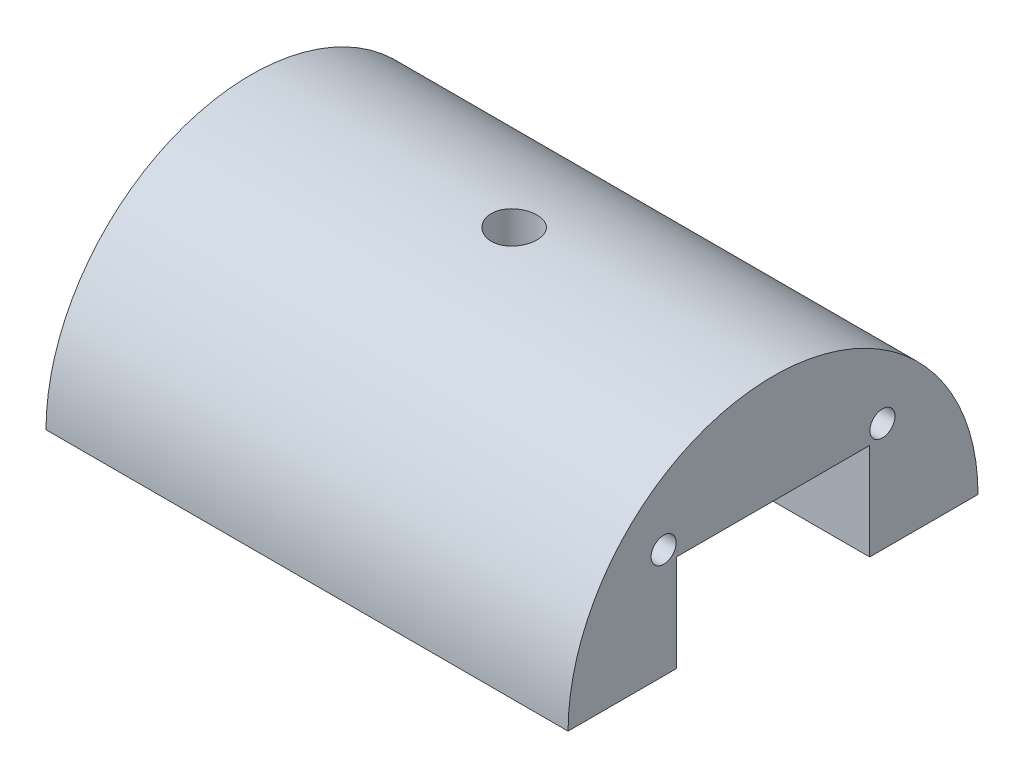
ISO-10303-21;
HEADER;
FILE_DESCRIPTION(('STEP AP214'),'2;1');
FILE_NAME('part.step','',(''),(''),'','','');
FILE_SCHEMA(('AUTOMOTIVE_DESIGN { 1 0 10303 214 1 1 1 1 }'));
ENDSEC;
DATA;
#1=APPLICATION_CONTEXT('core data for automotive mechanical design processes');
#2=APPLICATION_PROTOCOL_DEFINITION('international standard','automotive_design',2000,#1);
#3=PRODUCT_CONTEXT('',#1,'mechanical');
#4=PRODUCT('Part','Part','',(#3));
#5=PRODUCT_RELATED_PRODUCT_CATEGORY('part','',(#4));
#6=PRODUCT_DEFINITION_FORMATION('','',#4);
#7=PRODUCT_DEFINITION_CONTEXT('part definition',#1,'design');
#8=PRODUCT_DEFINITION('design','',#6,#7);
#9=PRODUCT_DEFINITION_SHAPE('','',#8);
#10=(LENGTH_UNIT() NAMED_UNIT(*) SI_UNIT(.MILLI.,.METRE.));
#11=(NAMED_UNIT(*) PLANE_ANGLE_UNIT() SI_UNIT($,.RADIAN.));
#12=(NAMED_UNIT(*) SI_UNIT($,.STERADIAN.) SOLID_ANGLE_UNIT());
#13=UNCERTAINTY_MEASURE_WITH_UNIT(LENGTH_MEASURE(1.E-05),#10,'distance_accuracy_value','');
#14=(GEOMETRIC_REPRESENTATION_CONTEXT(3) GLOBAL_UNCERTAINTY_ASSIGNED_CONTEXT((#13)) GLOBAL_UNIT_ASSIGNED_CONTEXT((#10,
#11,#12)) REPRESENTATION_CONTEXT('',''));
#15=CARTESIAN_POINT('',(0.,0.,0.));
#16=DIRECTION('',(0.,0.,1.));
#17=DIRECTION('',(1.,0.,0.));
#18=AXIS2_PLACEMENT_3D('',#15,#16,#17);
#19=CARTESIAN_POINT('',(68.58,0.,0.));
#20=DIRECTION('',(-1.,0.,0.));
#21=DIRECTION('',(0.,0.,1.));
#22=AXIS2_PLACEMENT_3D('',#19,#20,#21);
#23=CYLINDRICAL_SURFACE('',#22,26.924);
#24=CARTESIAN_POINT('',(0.,0.,0.));
#25=DIRECTION('',(1.,0.,0.));
#26=DIRECTION('',(0.,0.,-1.));
#27=AXIS2_PLACEMENT_3D('',#24,#25,#26);
#28=CIRCLE('',#27,26.924);
#29=CARTESIAN_POINT('',(0.,0.,-26.924));
#30=VERTEX_POINT('',#29);
#31=CARTESIAN_POINT('',(0.,0.,26.924));
#32=VERTEX_POINT('',#31);
#33=EDGE_CURVE('E145',#30,#32,#28,.T.);
#34=ORIENTED_EDGE('',*,*,#33,.T.);
#35=DIRECTION('',(-1.,0.,0.));
#36=VECTOR('',#35,1.);
#37=CARTESIAN_POINT('',(68.58,0.,26.924));
#38=LINE('',#37,#36);
#39=CARTESIAN_POINT('',(68.58,0.,26.924));
#40=VERTEX_POINT('',#39);
#41=EDGE_CURVE('E51',#40,#32,#38,.T.);
#42=ORIENTED_EDGE('',*,*,#41,.F.);
#43=CARTESIAN_POINT('',(68.58,0.,0.));
#44=DIRECTION('',(1.,0.,0.));
#45=DIRECTION('',(0.,0.,-1.));
#46=AXIS2_PLACEMENT_3D('',#43,#44,#45);
#47=CIRCLE('',#46,26.924);
#48=CARTESIAN_POINT('',(68.58,0.,-26.924));
#49=VERTEX_POINT('',#48);
#50=EDGE_CURVE('E95',#49,#40,#47,.T.);
#51=ORIENTED_EDGE('',*,*,#50,.F.);
#52=DIRECTION('',(-1.,0.,0.));
#53=VECTOR('',#52,1.);
#54=CARTESIAN_POINT('',(68.58,0.,-26.924));
#55=LINE('',#54,#53);
#56=EDGE_CURVE('E11',#49,#30,#55,.T.);
#57=ORIENTED_EDGE('',*,*,#56,.T.);
#58=EDGE_LOOP('',(#34,#42,#51,#57));
#59=FACE_BOUND('',#58,.T.);
#60=CARTESIAN_POINT('',(31.5738732502188,26.924,0.));
#61=CARTESIAN_POINT('',(31.573880467644,26.9239978731686,0.16795282377086));
#62=CARTESIAN_POINT('',(31.5880248421501,26.9224118013605,0.336014077377438));
#63=CARTESIAN_POINT('',(31.6442318142391,26.9162371802635,0.667469853790955));
#64=CARTESIAN_POINT('',(31.6863244800154,26.9116453973529,0.830859152583049));
#65=CARTESIAN_POINT('',(31.7971809773632,26.8999772372856,1.14812377576141));
#66=CARTESIAN_POINT('',(31.8659279046476,26.892902435143,1.30200505861782));
#67=CARTESIAN_POINT('',(32.028106783955,26.877057503395,1.5960136088482));
#68=CARTESIAN_POINT('',(32.1215341183294,26.8682876910045,1.73614344236809));
#69=CARTESIAN_POINT('',(32.3308640784616,26.8499903879873,1.99932235596585));
#70=CARTESIAN_POINT('',(32.4468537601396,26.8404600497171,2.12230200136813));
#71=CARTESIAN_POINT('',(32.6978295315298,26.8217391139873,2.3470922469333));
#72=CARTESIAN_POINT('',(32.8328165365553,26.8125485329245,2.44890182651153));
#73=CARTESIAN_POINT('',(33.1183975898188,26.7955191738104,2.62871385133344));
#74=CARTESIAN_POINT('',(33.2690320877883,26.7876840462471,2.70665242892706));
#75=CARTESIAN_POINT('',(33.581352740416,26.7742891687837,2.83610224245116));
#76=CARTESIAN_POINT('',(33.7430385595731,26.7687293498446,2.88761428024722));
#77=CARTESIAN_POINT('',(34.0721579049056,26.760541082333,2.96254049539763));
#78=CARTESIAN_POINT('',(34.2395646755468,26.75790051636,2.98607085173188));
#79=CARTESIAN_POINT('',(34.5759704368272,26.755812384767,3.00472505480262));
#80=CARTESIAN_POINT('',(34.7449693759405,26.7563647161702,2.99984981767127));
#81=CARTESIAN_POINT('',(35.0789575895171,26.7605888925428,2.96192680860176));
#82=CARTESIAN_POINT('',(35.2439615253862,26.7642466380616,2.92900636743911));
#83=CARTESIAN_POINT('',(35.5660879279614,26.7742475054022,2.8361257986776));
#84=CARTESIAN_POINT('',(35.7232102651323,26.7805906713433,2.77616522683183));
#85=CARTESIAN_POINT('',(36.0255127156376,26.7952638007762,2.63076749786786));
#86=CARTESIAN_POINT('',(36.1706656781115,26.8035981227373,2.54527434801725));
#87=CARTESIAN_POINT('',(36.4446117397396,26.8213109651513,2.35127845338699));
#88=CARTESIAN_POINT('',(36.5734042437426,26.8306895235675,2.24277487193024));
#89=CARTESIAN_POINT('',(36.8117129970115,26.8494968957598,2.00512932204653));
#90=CARTESIAN_POINT('',(36.9211197072121,26.8589257031982,1.87587747841178));
#91=CARTESIAN_POINT('',(37.1167005428384,26.8767228486608,1.60078453037611));
#92=CARTESIAN_POINT('',(37.2028746316969,26.8850911850158,1.45494339986479));
#93=CARTESIAN_POINT('',(37.3495415831353,26.8998282507239,1.15073218992766));
#94=CARTESIAN_POINT('',(37.4100283292888,26.9061965037423,0.992359137157203));
#95=CARTESIAN_POINT('',(37.5035204577636,26.9162112834744,0.667617968663869));
#96=CARTESIAN_POINT('',(37.5365268611869,26.9198579113167,0.501250150249824));
#97=CARTESIAN_POINT('',(37.5739811187138,26.9240055135237,0.166189989614451));
#98=CARTESIAN_POINT('',(37.5785800157501,26.9245231245804,-0.00248527091021788));
#99=CARTESIAN_POINT('',(37.559486239114,26.9223991157884,-0.338204088704568));
#100=CARTESIAN_POINT('',(37.5357940418684,26.9197575491407,-0.505247673404194));
#101=CARTESIAN_POINT('',(37.4609159976837,26.9116225036887,-0.83252125216817));
#102=CARTESIAN_POINT('',(37.4098014311447,26.9061364200208,-0.992767754128834));
#103=CARTESIAN_POINT('',(37.281603222077,26.892927230957,-1.30241291091289));
#104=CARTESIAN_POINT('',(37.2045188660953,26.885204064104,-1.45181126757437));
#105=CARTESIAN_POINT('',(37.0261985696567,26.8683418434311,-1.73619860561748));
#106=CARTESIAN_POINT('',(36.9248640493288,26.8591970651842,-1.87112542910987));
#107=CARTESIAN_POINT('',(36.7010604707987,26.8405346137823,-2.12210905236891));
#108=CARTESIAN_POINT('',(36.5785907508852,26.8310169289594,-2.23816526110391));
#109=CARTESIAN_POINT('',(36.3153314434852,26.8126307498702,-2.44864263194529));
#110=CARTESIAN_POINT('',(36.1744620065341,26.8037653650033,-2.54296423099207));
#111=CARTESIAN_POINT('',(35.8787931121105,26.7877366139625,-2.70660905353054));
#112=CARTESIAN_POINT('',(35.7239938842597,26.7805732197396,-2.77593268899971));
#113=CARTESIAN_POINT('',(35.4051923346114,26.7687797842086,-2.88744940808266));
#114=CARTESIAN_POINT('',(35.2412104749058,26.7641443394789,-2.92970039284396));
#115=CARTESIAN_POINT('',(34.9084251785088,26.7579154670125,-2.98605975487272));
#116=CARTESIAN_POINT('',(34.7396219169558,26.7563219289201,-3.00016915307462));
#117=CARTESIAN_POINT('',(34.4029754452572,26.7563600230508,-2.99982870776411));
#118=CARTESIAN_POINT('',(34.2351320532278,26.7579739933449,-2.98553526264385));
#119=CARTESIAN_POINT('',(33.9042477208199,26.7642074597693,-2.92912419882248));
#120=CARTESIAN_POINT('',(33.7412067839547,26.7688269580982,-2.88700655976745));
#121=CARTESIAN_POINT('',(33.4245651354866,26.780545841675,-2.77618836544685));
#122=CARTESIAN_POINT('',(33.2709623441081,26.7876446782584,-2.70749369117697));
#123=CARTESIAN_POINT('',(32.977440606557,26.8035234099834,-2.54548707981419));
#124=CARTESIAN_POINT('',(32.8375216912934,26.8123033089222,-2.45217508711744));
#125=CARTESIAN_POINT('',(32.5745384998087,26.8306128626374,-2.24299781612255));
#126=CARTESIAN_POINT('',(32.4515672711834,26.8401462368875,-2.12701587624753));
#127=CARTESIAN_POINT('',(32.2267686382193,26.8588550109552,-1.87602908584856));
#128=CARTESIAN_POINT('',(32.1249462690309,26.868030325104,-1.7410197180606));
#129=CARTESIAN_POINT('',(31.9450805313774,26.8850192732339,-1.45534743475141));
#130=CARTESIAN_POINT('',(31.8671108291099,26.8928286575211,-1.30463791451834));
#131=CARTESIAN_POINT('',(31.7376926179226,26.9061613127419,-0.992269225425752));
#132=CARTESIAN_POINT('',(31.686214670522,26.9116871199078,-0.830622437491909));
#133=CARTESIAN_POINT('',(31.6238578240089,26.9184656463359,-0.556744401875371));
#134=CARTESIAN_POINT('',(31.6051397839259,26.9205311665339,-0.446254343404225));
#135=CARTESIAN_POINT('',(31.5801451253192,26.9232990485142,-0.223858910871359));
#136=CARTESIAN_POINT('',(31.5738684392468,26.9240014176976,-0.111953544497175));
#137=CARTESIAN_POINT('',(31.5738732502188,26.924,0.));
#138=B_SPLINE_CURVE_WITH_KNOTS('',3,(#60,#61,#62,#63,#64,#65,#66,#67,#68,#69,#70,#71,#72,#73,
#74,#75,#76,#77,#78,#79,#80,#81,#82,#83,#84,#85,#86,#87,#88,#89,#90,#91,#92,#93,#94,#95,#96,#97,
#98,#99,#100,#101,#102,#103,#104,#105,#106,#107,#108,#109,#110,#111,#112,#113,#114,#115,#116,
#117,#118,#119,#120,#121,#122,#123,#124,#125,#126,#127,#128,#129,#130,#131,#132,#133,#134,#135,
#136,#137),.UNSPECIFIED.,.T.,.F.,(4,2,2,2,2,2,2,2,2,2,2,2,2,2,2,2,2,2,2,2,2,2,2,2,2,2,2,2,2,2,2,
2,2,2,2,2,2,2,4),(0.,0.503449609050465,1.00744173433363,1.51111474635794,2.01469358895601,
2.52025545738059,3.02584169271673,3.53276905615357,4.03968103688602,4.54448090511175,
5.04926449271168,5.55176840282464,6.05428056896058,6.55790293483692,7.06154361595289,
7.567945160898,8.07434750289547,8.58087035710044,9.08737438932099,9.59118300108128,
10.094983128737,10.5974800026874,11.0999906825701,11.6045799082057,12.1091849346398,
12.6160574621408,13.1229216357769,13.6286981121329,14.134456239345,14.6374371594826,
15.1404184475607,15.6432884989843,16.1461596862646,16.6516902681197,17.1573410697981,
17.6645381067713,18.1711703065927,18.5067602238137,18.842348318991),.UNSPECIFIED.);
#139=CARTESIAN_POINT('',(31.5738732502188,26.924,0.));
#140=VERTEX_POINT('',#139);
#141=EDGE_CURVE('E146',#140,#140,#138,.T.);
#142=ORIENTED_EDGE('',*,*,#141,.F.);
#143=EDGE_LOOP('',(#142));
#144=FACE_BOUND('',#143,.T.);
#145=ADVANCED_FACE('F40',(#59,#144),#23,.T.);
#146=CARTESIAN_POINT('',(68.58,0.,0.));
#147=DIRECTION('',(0.,1.,0.));
#148=DIRECTION('',(0.,0.,1.));
#149=AXIS2_PLACEMENT_3D('',#146,#147,#148);
#150=PLANE('',#149);
#151=DIRECTION('',(0.,0.,-1.));
#152=VECTOR('',#151,1.);
#153=CARTESIAN_POINT('',(0.,0.,0.));
#154=LINE('',#153,#152);
#155=CARTESIAN_POINT('',(0.,0.,-12.7));
#156=VERTEX_POINT('',#155);
#157=EDGE_CURVE('E141',#156,#30,#154,.T.);
#158=ORIENTED_EDGE('',*,*,#157,.T.);
#159=ORIENTED_EDGE('',*,*,#56,.F.);
#160=DIRECTION('',(0.,0.,-1.));
#161=VECTOR('',#160,1.);
#162=CARTESIAN_POINT('',(68.58,0.,0.));
#163=LINE('',#162,#161);
#164=CARTESIAN_POINT('',(68.58,0.,-12.7));
#165=VERTEX_POINT('',#164);
#166=EDGE_CURVE('E167',#165,#49,#163,.T.);
#167=ORIENTED_EDGE('',*,*,#166,.F.);
#168=DIRECTION('',(-1.,0.,0.));
#169=VECTOR('',#168,1.);
#170=CARTESIAN_POINT('',(68.58,0.,-12.7));
#171=LINE('',#170,#169);
#172=EDGE_CURVE('E140',#165,#156,#171,.T.);
#173=ORIENTED_EDGE('',*,*,#172,.T.);
#174=EDGE_LOOP('',(#158,#159,#167,#173));
#175=FACE_BOUND('',#174,.T.);
#176=ADVANCED_FACE('F42',(#175),#150,.F.);
#177=CARTESIAN_POINT('',(68.58,0.,0.));
#178=DIRECTION('',(0.,1.,0.));
#179=DIRECTION('',(0.,0.,1.));
#180=AXIS2_PLACEMENT_3D('',#177,#178,#179);
#181=PLANE('',#180);
#182=DIRECTION('',(0.,0.,-1.));
#183=VECTOR('',#182,1.);
#184=CARTESIAN_POINT('',(0.,0.,0.));
#185=LINE('',#184,#183);
#186=CARTESIAN_POINT('',(0.,0.,12.7));
#187=VERTEX_POINT('',#186);
#188=EDGE_CURVE('E149',#32,#187,#185,.T.);
#189=ORIENTED_EDGE('',*,*,#188,.T.);
#190=DIRECTION('',(-1.,0.,0.));
#191=VECTOR('',#190,1.);
#192=CARTESIAN_POINT('',(68.58,0.,12.7));
#193=LINE('',#192,#191);
#194=CARTESIAN_POINT('',(68.58,0.,12.7));
#195=VERTEX_POINT('',#194);
#196=EDGE_CURVE('E112',#195,#187,#193,.T.);
#197=ORIENTED_EDGE('',*,*,#196,.F.);
#198=DIRECTION('',(0.,0.,-1.));
#199=VECTOR('',#198,1.);
#200=CARTESIAN_POINT('',(68.58,0.,0.));
#201=LINE('',#200,#199);
#202=EDGE_CURVE('E122',#40,#195,#201,.T.);
#203=ORIENTED_EDGE('',*,*,#202,.F.);
#204=ORIENTED_EDGE('',*,*,#41,.T.);
#205=EDGE_LOOP('',(#189,#197,#203,#204));
#206=FACE_BOUND('',#205,.T.);
#207=ADVANCED_FACE('F178',(#206),#181,.F.);
#208=CARTESIAN_POINT('',(68.58,0.,12.7));
#209=DIRECTION('',(0.,0.,-1.));
#210=DIRECTION('',(0.,1.,0.));
#211=AXIS2_PLACEMENT_3D('',#208,#209,#210);
#212=PLANE('',#211);
#213=DIRECTION('',(0.,-1.,0.));
#214=VECTOR('',#213,1.);
#215=CARTESIAN_POINT('',(0.,0.,12.7));
#216=LINE('',#215,#214);
#217=CARTESIAN_POINT('',(0.,12.7,12.7));
#218=VERTEX_POINT('',#217);
#219=EDGE_CURVE('E110',#218,#187,#216,.T.);
#220=ORIENTED_EDGE('',*,*,#219,.F.);
#221=DIRECTION('',(-1.,0.,0.));
#222=VECTOR('',#221,1.);
#223=CARTESIAN_POINT('',(68.58,12.7,12.7));
#224=LINE('',#223,#222);
#225=CARTESIAN_POINT('',(68.58,12.7,12.7));
#226=VERTEX_POINT('',#225);
#227=EDGE_CURVE('E104',#226,#218,#224,.T.);
#228=ORIENTED_EDGE('',*,*,#227,.F.);
#229=DIRECTION('',(0.,-1.,0.));
#230=VECTOR('',#229,1.);
#231=CARTESIAN_POINT('',(68.58,0.,12.7));
#232=LINE('',#231,#230);
#233=EDGE_CURVE('E108',#226,#195,#232,.T.);
#234=ORIENTED_EDGE('',*,*,#233,.T.);
#235=ORIENTED_EDGE('',*,*,#196,.T.);
#236=EDGE_LOOP('',(#220,#228,#234,#235));
#237=FACE_BOUND('',#236,.T.);
#238=ADVANCED_FACE('F106',(#237),#212,.T.);
#239=CARTESIAN_POINT('',(68.58,12.7,0.));
#240=DIRECTION('',(0.,1.,0.));
#241=DIRECTION('',(0.,0.,1.));
#242=AXIS2_PLACEMENT_3D('',#239,#240,#241);
#243=PLANE('',#242);
#244=CARTESIAN_POINT('',(34.5738732502188,12.7,0.));
#245=DIRECTION('',(0.,1.,0.));
#246=DIRECTION('',(0.,0.,1.));
#247=AXIS2_PLACEMENT_3D('',#244,#245,#246);
#248=CIRCLE('',#247,3.);
#249=CARTESIAN_POINT('',(34.5738732502188,12.7,3.));
#250=VERTEX_POINT('',#249);
#251=EDGE_CURVE('E44',#250,#250,#248,.F.);
#252=ORIENTED_EDGE('',*,*,#251,.F.);
#253=EDGE_LOOP('',(#252));
#254=FACE_BOUND('',#253,.T.);
#255=DIRECTION('',(0.,0.,-1.));
#256=VECTOR('',#255,1.);
#257=CARTESIAN_POINT('',(0.,12.7,0.));
#258=LINE('',#257,#256);
#259=CARTESIAN_POINT('',(0.,12.7,-12.7));
#260=VERTEX_POINT('',#259);
#261=EDGE_CURVE('E81',#218,#260,#258,.T.);
#262=ORIENTED_EDGE('',*,*,#261,.T.);
#263=DIRECTION('',(-1.,0.,0.));
#264=VECTOR('',#263,1.);
#265=CARTESIAN_POINT('',(68.58,12.7,-12.7));
#266=LINE('',#265,#264);
#267=CARTESIAN_POINT('',(68.58,12.7,-12.7));
#268=VERTEX_POINT('',#267);
#269=EDGE_CURVE('E113',#268,#260,#266,.T.);
#270=ORIENTED_EDGE('',*,*,#269,.F.);
#271=DIRECTION('',(0.,0.,-1.));
#272=VECTOR('',#271,1.);
#273=CARTESIAN_POINT('',(68.58,12.7,0.));
#274=LINE('',#273,#272);
#275=EDGE_CURVE('E115',#226,#268,#274,.T.);
#276=ORIENTED_EDGE('',*,*,#275,.F.);
#277=ORIENTED_EDGE('',*,*,#227,.T.);
#278=EDGE_LOOP('',(#262,#270,#276,#277));
#279=FACE_BOUND('',#278,.T.);
#280=ADVANCED_FACE('F116',(#254,#279),#243,.F.);
#281=CARTESIAN_POINT('',(68.58,14.3684097937106,14.3684097937107));
#282=DIRECTION('',(-1.,0.,0.));
#283=DIRECTION('',(0.,0.,1.));
#284=AXIS2_PLACEMENT_3D('',#281,#282,#283);
#285=CYLINDRICAL_SURFACE('',#284,1.651);
#286=CARTESIAN_POINT('',(68.58,14.3684097937106,14.3684097937107));
#287=DIRECTION('',(1.,0.,0.));
#288=DIRECTION('',(0.,0.,-1.));
#289=AXIS2_PLACEMENT_3D('',#286,#287,#288);
#290=CIRCLE('',#289,1.651);
#291=CARTESIAN_POINT('',(68.58,14.3684097937106,12.7174097937107));
#292=VERTEX_POINT('',#291);
#293=EDGE_CURVE('E132',#292,#292,#290,.T.);
#294=ORIENTED_EDGE('',*,*,#293,.T.);
#295=EDGE_LOOP('',(#294));
#296=FACE_BOUND('',#295,.T.);
#297=CARTESIAN_POINT('',(0.,14.3684097937106,14.3684097937107));
#298=DIRECTION('',(1.,0.,0.));
#299=DIRECTION('',(0.,0.,-1.));
#300=AXIS2_PLACEMENT_3D('',#297,#298,#299);
#301=CIRCLE('',#300,1.651);
#302=CARTESIAN_POINT('',(0.,14.3684097937106,12.7174097937107));
#303=VERTEX_POINT('',#302);
#304=EDGE_CURVE('E159',#303,#303,#301,.T.);
#305=ORIENTED_EDGE('',*,*,#304,.F.);
#306=EDGE_LOOP('',(#305));
#307=FACE_BOUND('',#306,.T.);
#308=ADVANCED_FACE('F189',(#296,#307),#285,.F.);
#309=CARTESIAN_POINT('',(68.58,0.,-12.7));
#310=DIRECTION('',(0.,0.,-1.));
#311=DIRECTION('',(0.,1.,0.));
#312=AXIS2_PLACEMENT_3D('',#309,#310,#311);
#313=PLANE('',#312);
#314=DIRECTION('',(0.,-1.,0.));
#315=VECTOR('',#314,1.);
#316=CARTESIAN_POINT('',(0.,0.,-12.7));
#317=LINE('',#316,#315);
#318=EDGE_CURVE('E87',#260,#156,#317,.T.);
#319=ORIENTED_EDGE('',*,*,#318,.T.);
#320=ORIENTED_EDGE('',*,*,#172,.F.);
#321=DIRECTION('',(0.,-1.,0.));
#322=VECTOR('',#321,1.);
#323=CARTESIAN_POINT('',(68.58,0.,-12.7));
#324=LINE('',#323,#322);
#325=EDGE_CURVE('E59',#268,#165,#324,.T.);
#326=ORIENTED_EDGE('',*,*,#325,.F.);
#327=ORIENTED_EDGE('',*,*,#269,.T.);
#328=EDGE_LOOP('',(#319,#320,#326,#327));
#329=FACE_BOUND('',#328,.T.);
#330=ADVANCED_FACE('F186',(#329),#313,.F.);
#331=CARTESIAN_POINT('',(68.58,14.3684097937106,-14.3684097937107));
#332=DIRECTION('',(-1.,0.,0.));
#333=DIRECTION('',(0.,0.,1.));
#334=AXIS2_PLACEMENT_3D('',#331,#332,#333);
#335=CYLINDRICAL_SURFACE('',#334,1.651);
#336=CARTESIAN_POINT('',(68.58,14.3684097937106,-14.3684097937107));
#337=DIRECTION('',(1.,0.,0.));
#338=DIRECTION('',(0.,0.,-1.));
#339=AXIS2_PLACEMENT_3D('',#336,#337,#338);
#340=CIRCLE('',#339,1.651);
#341=CARTESIAN_POINT('',(68.58,14.3684097937106,-16.0194097937107));
#342=VERTEX_POINT('',#341);
#343=EDGE_CURVE('E136',#342,#342,#340,.F.);
#344=ORIENTED_EDGE('',*,*,#343,.F.);
#345=EDGE_LOOP('',(#344));
#346=FACE_BOUND('',#345,.T.);
#347=CARTESIAN_POINT('',(0.,14.3684097937106,-14.3684097937107));
#348=DIRECTION('',(1.,0.,0.));
#349=DIRECTION('',(0.,0.,-1.));
#350=AXIS2_PLACEMENT_3D('',#347,#348,#349);
#351=CIRCLE('',#350,1.651);
#352=CARTESIAN_POINT('',(0.,14.3684097937106,-16.0194097937107));
#353=VERTEX_POINT('',#352);
#354=EDGE_CURVE('E163',#353,#353,#351,.F.);
#355=ORIENTED_EDGE('',*,*,#354,.T.);
#356=EDGE_LOOP('',(#355));
#357=FACE_BOUND('',#356,.T.);
#358=ADVANCED_FACE('F188',(#346,#357),#335,.F.);
#359=CARTESIAN_POINT('',(68.58,0.,0.));
#360=DIRECTION('',(1.,0.,0.));
#361=DIRECTION('',(0.,0.,-1.));
#362=AXIS2_PLACEMENT_3D('',#359,#360,#361);
#363=PLANE('',#362);
#364=ORIENTED_EDGE('',*,*,#166,.T.);
#365=ORIENTED_EDGE('',*,*,#50,.T.);
#366=ORIENTED_EDGE('',*,*,#202,.T.);
#367=ORIENTED_EDGE('',*,*,#233,.F.);
#368=ORIENTED_EDGE('',*,*,#275,.T.);
#369=ORIENTED_EDGE('',*,*,#325,.T.);
#370=EDGE_LOOP('',(#364,#365,#366,#367,#368,#369));
#371=FACE_BOUND('',#370,.T.);
#372=ORIENTED_EDGE('',*,*,#293,.F.);
#373=EDGE_LOOP('',(#372));
#374=FACE_BOUND('',#373,.T.);
#375=ORIENTED_EDGE('',*,*,#343,.T.);
#376=EDGE_LOOP('',(#375));
#377=FACE_BOUND('',#376,.T.);
#378=ADVANCED_FACE('F119',(#371,#374,#377),#363,.T.);
#379=CARTESIAN_POINT('',(0.,0.,0.));
#380=DIRECTION('',(1.,0.,0.));
#381=DIRECTION('',(0.,0.,-1.));
#382=AXIS2_PLACEMENT_3D('',#379,#380,#381);
#383=PLANE('',#382);
#384=ORIENTED_EDGE('',*,*,#157,.F.);
#385=ORIENTED_EDGE('',*,*,#318,.F.);
#386=ORIENTED_EDGE('',*,*,#261,.F.);
#387=ORIENTED_EDGE('',*,*,#219,.T.);
#388=ORIENTED_EDGE('',*,*,#188,.F.);
#389=ORIENTED_EDGE('',*,*,#33,.F.);
#390=EDGE_LOOP('',(#384,#385,#386,#387,#388,#389));
#391=FACE_BOUND('',#390,.T.);
#392=ORIENTED_EDGE('',*,*,#304,.T.);
#393=EDGE_LOOP('',(#392));
#394=FACE_BOUND('',#393,.T.);
#395=ORIENTED_EDGE('',*,*,#354,.F.);
#396=EDGE_LOOP('',(#395));
#397=FACE_BOUND('',#396,.T.);
#398=ADVANCED_FACE('F181',(#391,#394,#397),#383,.F.);
#399=CARTESIAN_POINT('',(34.5738732502188,26.924,0.));
#400=DIRECTION('',(0.,-1.,0.));
#401=DIRECTION('',(0.,0.,-1.));
#402=AXIS2_PLACEMENT_3D('',#399,#400,#401);
#403=CYLINDRICAL_SURFACE('',#402,3.);
#404=ORIENTED_EDGE('',*,*,#251,.T.);
#405=EDGE_LOOP('',(#404));
#406=FACE_BOUND('',#405,.T.);
#407=ORIENTED_EDGE('',*,*,#141,.T.);
#408=EDGE_LOOP('',(#407));
#409=FACE_BOUND('',#408,.T.);
#410=ADVANCED_FACE('F218',(#406,#409),#403,.F.);
#411=CLOSED_SHELL('',(#145,#176,#207,#238,#280,#308,#330,#358,#378,#398,#410));
#412=MANIFOLD_SOLID_BREP('B2',#411);
#413=ADVANCED_BREP_SHAPE_REPRESENTATION('',(#18,#412),#14);
#414=SHAPE_DEFINITION_REPRESENTATION(#9,#413);
ENDSEC;
END-ISO-10303-21;
